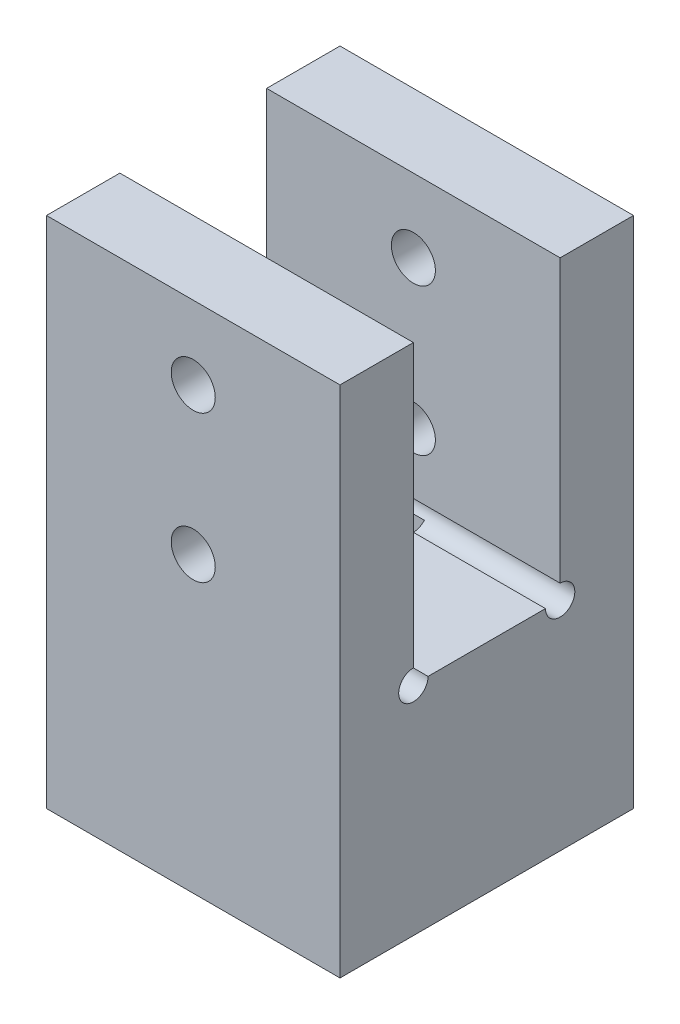
ISO-10303-21;
HEADER;
FILE_DESCRIPTION(('STEP AP214'),'2;1');
FILE_NAME('part.step','',(''),(''),'','','');
FILE_SCHEMA(('AUTOMOTIVE_DESIGN { 1 0 10303 214 1 1 1 1 }'));
ENDSEC;
DATA;
#1=APPLICATION_CONTEXT('core data for automotive mechanical design processes');
#2=APPLICATION_PROTOCOL_DEFINITION('international standard','automotive_design',2000,#1);
#3=PRODUCT_CONTEXT('',#1,'mechanical');
#4=PRODUCT('Part','Part','',(#3));
#5=PRODUCT_RELATED_PRODUCT_CATEGORY('part','',(#4));
#6=PRODUCT_DEFINITION_FORMATION('','',#4);
#7=PRODUCT_DEFINITION_CONTEXT('part definition',#1,'design');
#8=PRODUCT_DEFINITION('design','',#6,#7);
#9=PRODUCT_DEFINITION_SHAPE('','',#8);
#10=(LENGTH_UNIT() NAMED_UNIT(*) SI_UNIT(.MILLI.,.METRE.));
#11=(NAMED_UNIT(*) PLANE_ANGLE_UNIT() SI_UNIT($,.RADIAN.));
#12=(NAMED_UNIT(*) SI_UNIT($,.STERADIAN.) SOLID_ANGLE_UNIT());
#13=UNCERTAINTY_MEASURE_WITH_UNIT(LENGTH_MEASURE(1.E-05),#10,'distance_accuracy_value','');
#14=(GEOMETRIC_REPRESENTATION_CONTEXT(3) GLOBAL_UNCERTAINTY_ASSIGNED_CONTEXT((#13)) GLOBAL_UNIT_ASSIGNED_CONTEXT((#10,
#11,#12)) REPRESENTATION_CONTEXT('',''));
#15=CARTESIAN_POINT('',(0.,0.,0.));
#16=DIRECTION('',(0.,0.,1.));
#17=DIRECTION('',(1.,0.,0.));
#18=AXIS2_PLACEMENT_3D('',#15,#16,#17);
#19=CARTESIAN_POINT('',(-10.,-17.5,5.));
#20=DIRECTION('',(1.,0.,0.));
#21=DIRECTION('',(0.,0.,-1.));
#22=AXIS2_PLACEMENT_3D('',#19,#20,#21);
#23=PLANE('',#22);
#24=DIRECTION('',(0.,1.,0.));
#25=VECTOR('',#24,1.);
#26=CARTESIAN_POINT('',(-10.,-17.5,4.25));
#27=LINE('',#26,#25);
#28=CARTESIAN_POINT('',(-10.,-17.5,4.25));
#29=VERTEX_POINT('',#28);
#30=CARTESIAN_POINT('',(-10.,-3.36143782776615,4.25));
#31=VERTEX_POINT('',#30);
#32=EDGE_CURVE('E163',#29,#31,#27,.T.);
#33=ORIENTED_EDGE('',*,*,#32,.T.);
#34=CARTESIAN_POINT('',(-10.,-2.7,5.));
#35=DIRECTION('',(1.,0.,0.));
#36=DIRECTION('',(0.,0.,1.));
#37=AXIS2_PLACEMENT_3D('',#34,#35,#36);
#38=CIRCLE('',#37,1.);
#39=CARTESIAN_POINT('',(-10.,-1.7,5.));
#40=VERTEX_POINT('',#39);
#41=EDGE_CURVE('E213',#31,#40,#38,.T.);
#42=ORIENTED_EDGE('',*,*,#41,.T.);
#43=DIRECTION('',(0.,-1.,0.));
#44=VECTOR('',#43,1.);
#45=CARTESIAN_POINT('',(-10.,-17.5,5.));
#46=LINE('',#45,#44);
#47=CARTESIAN_POINT('',(-10.,17.5,5.));
#48=VERTEX_POINT('',#47);
#49=EDGE_CURVE('E285',#48,#40,#46,.T.);
#50=ORIENTED_EDGE('',*,*,#49,.F.);
#51=DIRECTION('',(0.,0.,-1.));
#52=VECTOR('',#51,1.);
#53=CARTESIAN_POINT('',(-10.,17.5,5.));
#54=LINE('',#53,#52);
#55=CARTESIAN_POINT('',(-10.,17.5,0.));
#56=VERTEX_POINT('',#55);
#57=EDGE_CURVE('E308',#48,#56,#54,.T.);
#58=ORIENTED_EDGE('',*,*,#57,.T.);
#59=DIRECTION('',(0.,-1.,0.));
#60=VECTOR('',#59,1.);
#61=CARTESIAN_POINT('',(-10.,-17.5,0.));
#62=LINE('',#61,#60);
#63=CARTESIAN_POINT('',(-10.,-17.5,0.));
#64=VERTEX_POINT('',#63);
#65=EDGE_CURVE('E296',#56,#64,#62,.T.);
#66=ORIENTED_EDGE('',*,*,#65,.T.);
#67=DIRECTION('',(0.,0.,-1.));
#68=VECTOR('',#67,1.);
#69=CARTESIAN_POINT('',(-10.,-17.5,5.));
#70=LINE('',#69,#68);
#71=EDGE_CURVE('E305',#29,#64,#70,.T.);
#72=ORIENTED_EDGE('',*,*,#71,.F.);
#73=EDGE_LOOP('',(#33,#42,#50,#58,#66,#72));
#74=FACE_BOUND('',#73,.T.);
#75=ADVANCED_FACE('F38',(#74),#23,.F.);
#76=CARTESIAN_POINT('',(-10.,-17.5,20.));
#77=DIRECTION('',(1.,0.,0.));
#78=DIRECTION('',(0.,0.,-1.));
#79=AXIS2_PLACEMENT_3D('',#76,#77,#78);
#80=PLANE('',#79);
#81=DIRECTION('',(0.,-1.,0.));
#82=VECTOR('',#81,1.);
#83=CARTESIAN_POINT('',(-10.,-17.5,15.75));
#84=LINE('',#83,#82);
#85=CARTESIAN_POINT('',(-10.,-3.36143782776615,15.75));
#86=VERTEX_POINT('',#85);
#87=CARTESIAN_POINT('',(-10.,-17.5,15.75));
#88=VERTEX_POINT('',#87);
#89=EDGE_CURVE('E53',#86,#88,#84,.T.);
#90=ORIENTED_EDGE('',*,*,#89,.T.);
#91=DIRECTION('',(0.,0.,-1.));
#92=VECTOR('',#91,1.);
#93=CARTESIAN_POINT('',(-10.,-17.5,20.));
#94=LINE('',#93,#92);
#95=CARTESIAN_POINT('',(-10.,-17.5,20.));
#96=VERTEX_POINT('',#95);
#97=EDGE_CURVE('E253',#96,#88,#94,.T.);
#98=ORIENTED_EDGE('',*,*,#97,.F.);
#99=DIRECTION('',(0.,-1.,0.));
#100=VECTOR('',#99,1.);
#101=CARTESIAN_POINT('',(-10.,-17.5,20.));
#102=LINE('',#101,#100);
#103=CARTESIAN_POINT('',(-10.,17.5,20.));
#104=VERTEX_POINT('',#103);
#105=EDGE_CURVE('E246',#104,#96,#102,.T.);
#106=ORIENTED_EDGE('',*,*,#105,.F.);
#107=DIRECTION('',(0.,0.,-1.));
#108=VECTOR('',#107,1.);
#109=CARTESIAN_POINT('',(-10.,17.5,20.));
#110=LINE('',#109,#108);
#111=CARTESIAN_POINT('',(-10.,17.5,15.));
#112=VERTEX_POINT('',#111);
#113=EDGE_CURVE('E264',#104,#112,#110,.T.);
#114=ORIENTED_EDGE('',*,*,#113,.T.);
#115=DIRECTION('',(0.,-1.,0.));
#116=VECTOR('',#115,1.);
#117=CARTESIAN_POINT('',(-10.,-17.5,15.));
#118=LINE('',#117,#116);
#119=CARTESIAN_POINT('',(-10.,-1.7,15.));
#120=VERTEX_POINT('',#119);
#121=EDGE_CURVE('E243',#112,#120,#118,.T.);
#122=ORIENTED_EDGE('',*,*,#121,.T.);
#123=CARTESIAN_POINT('',(-10.,-2.7,15.));
#124=DIRECTION('',(1.,0.,0.));
#125=DIRECTION('',(0.,0.,-1.));
#126=AXIS2_PLACEMENT_3D('',#123,#124,#125);
#127=CIRCLE('',#126,1.);
#128=EDGE_CURVE('E205',#120,#86,#127,.T.);
#129=ORIENTED_EDGE('',*,*,#128,.T.);
#130=EDGE_LOOP('',(#90,#98,#106,#114,#122,#129));
#131=FACE_BOUND('',#130,.T.);
#132=ADVANCED_FACE('F350',(#131),#80,.F.);
#133=CARTESIAN_POINT('',(0.,0.,5.));
#134=DIRECTION('',(0.,0.,-1.));
#135=DIRECTION('',(-1.,0.,0.));
#136=AXIS2_PLACEMENT_3D('',#133,#134,#135);
#137=PLANE('',#136);
#138=CARTESIAN_POINT('',(0.,12.5,5.));
#139=DIRECTION('',(0.,0.,-1.));
#140=DIRECTION('',(-1.,0.,0.));
#141=AXIS2_PLACEMENT_3D('',#138,#139,#140);
#142=CIRCLE('',#141,1.5);
#143=CARTESIAN_POINT('',(-1.5,12.5,5.));
#144=VERTEX_POINT('',#143);
#145=EDGE_CURVE('E200',#144,#144,#142,.T.);
#146=ORIENTED_EDGE('',*,*,#145,.T.);
#147=EDGE_LOOP('',(#146));
#148=FACE_BOUND('',#147,.T.);
#149=CARTESIAN_POINT('',(0.,2.50000000000001,5.));
#150=DIRECTION('',(0.,0.,-1.));
#151=DIRECTION('',(-1.,0.,0.));
#152=AXIS2_PLACEMENT_3D('',#149,#150,#151);
#153=CIRCLE('',#152,1.5);
#154=CARTESIAN_POINT('',(-1.5,2.50000000000001,5.));
#155=VERTEX_POINT('',#154);
#156=EDGE_CURVE('E192',#155,#155,#153,.T.);
#157=ORIENTED_EDGE('',*,*,#156,.T.);
#158=EDGE_LOOP('',(#157));
#159=FACE_BOUND('',#158,.T.);
#160=ORIENTED_EDGE('',*,*,#49,.T.);
#161=DIRECTION('',(1.,0.,0.));
#162=VECTOR('',#161,1.);
#163=CARTESIAN_POINT('',(-10.,-1.7,5.));
#164=LINE('',#163,#162);
#165=CARTESIAN_POINT('',(10.,-1.7,5.));
#166=VERTEX_POINT('',#165);
#167=EDGE_CURVE('E233',#40,#166,#164,.T.);
#168=ORIENTED_EDGE('',*,*,#167,.T.);
#169=DIRECTION('',(0.,1.,0.));
#170=VECTOR('',#169,1.);
#171=CARTESIAN_POINT('',(10.,-17.5,5.));
#172=LINE('',#171,#170);
#173=CARTESIAN_POINT('',(10.,17.5,5.));
#174=VERTEX_POINT('',#173);
#175=EDGE_CURVE('E278',#166,#174,#172,.T.);
#176=ORIENTED_EDGE('',*,*,#175,.T.);
#177=DIRECTION('',(-1.,0.,0.));
#178=VECTOR('',#177,1.);
#179=CARTESIAN_POINT('',(-10.,17.5,5.));
#180=LINE('',#179,#178);
#181=EDGE_CURVE('E281',#174,#48,#180,.T.);
#182=ORIENTED_EDGE('',*,*,#181,.T.);
#183=EDGE_LOOP('',(#160,#168,#176,#182));
#184=FACE_BOUND('',#183,.T.);
#185=ADVANCED_FACE('F329',(#148,#159,#184),#137,.F.);
#186=CARTESIAN_POINT('',(10.,-17.5,5.));
#187=DIRECTION('',(-1.,0.,0.));
#188=DIRECTION('',(0.,0.,1.));
#189=AXIS2_PLACEMENT_3D('',#186,#187,#188);
#190=PLANE('',#189);
#191=DIRECTION('',(0.,0.,-1.));
#192=VECTOR('',#191,1.);
#193=CARTESIAN_POINT('',(10.,-2.7,15.));
#194=LINE('',#193,#192);
#195=CARTESIAN_POINT('',(10.,-2.7,14.));
#196=VERTEX_POINT('',#195);
#197=CARTESIAN_POINT('',(10.,-2.7,6.));
#198=VERTEX_POINT('',#197);
#199=EDGE_CURVE('E152',#196,#198,#194,.T.);
#200=ORIENTED_EDGE('',*,*,#199,.F.);
#201=CARTESIAN_POINT('',(10.,-2.7,15.));
#202=DIRECTION('',(1.,0.,0.));
#203=DIRECTION('',(0.,0.,-1.));
#204=AXIS2_PLACEMENT_3D('',#201,#202,#203);
#205=CIRCLE('',#204,1.);
#206=CARTESIAN_POINT('',(10.,-1.7,15.));
#207=VERTEX_POINT('',#206);
#208=EDGE_CURVE('E210',#207,#196,#205,.T.);
#209=ORIENTED_EDGE('',*,*,#208,.F.);
#210=DIRECTION('',(0.,1.,0.));
#211=VECTOR('',#210,1.);
#212=CARTESIAN_POINT('',(10.,-17.5,15.));
#213=LINE('',#212,#211);
#214=CARTESIAN_POINT('',(10.,17.5,15.));
#215=VERTEX_POINT('',#214);
#216=EDGE_CURVE('E237',#207,#215,#213,.T.);
#217=ORIENTED_EDGE('',*,*,#216,.T.);
#218=DIRECTION('',(0.,0.,-1.));
#219=VECTOR('',#218,1.);
#220=CARTESIAN_POINT('',(10.,17.5,20.));
#221=LINE('',#220,#219);
#222=CARTESIAN_POINT('',(10.,17.5,20.));
#223=VERTEX_POINT('',#222);
#224=EDGE_CURVE('E268',#223,#215,#221,.T.);
#225=ORIENTED_EDGE('',*,*,#224,.F.);
#226=DIRECTION('',(0.,1.,0.));
#227=VECTOR('',#226,1.);
#228=CARTESIAN_POINT('',(10.,-17.5,20.));
#229=LINE('',#228,#227);
#230=CARTESIAN_POINT('',(10.,-17.5,20.));
#231=VERTEX_POINT('',#230);
#232=EDGE_CURVE('E238',#231,#223,#229,.T.);
#233=ORIENTED_EDGE('',*,*,#232,.F.);
#234=DIRECTION('',(0.,0.,-1.));
#235=VECTOR('',#234,1.);
#236=CARTESIAN_POINT('',(10.,-17.5,5.));
#237=LINE('',#236,#235);
#238=CARTESIAN_POINT('',(10.,-17.5,0.));
#239=VERTEX_POINT('',#238);
#240=EDGE_CURVE('E289',#231,#239,#237,.T.);
#241=ORIENTED_EDGE('',*,*,#240,.T.);
#242=DIRECTION('',(0.,1.,0.));
#243=VECTOR('',#242,1.);
#244=CARTESIAN_POINT('',(10.,-17.5,0.));
#245=LINE('',#244,#243);
#246=CARTESIAN_POINT('',(10.,17.5,0.));
#247=VERTEX_POINT('',#246);
#248=EDGE_CURVE('E277',#239,#247,#245,.T.);
#249=ORIENTED_EDGE('',*,*,#248,.T.);
#250=DIRECTION('',(0.,0.,-1.));
#251=VECTOR('',#250,1.);
#252=CARTESIAN_POINT('',(10.,17.5,5.));
#253=LINE('',#252,#251);
#254=EDGE_CURVE('E312',#174,#247,#253,.T.);
#255=ORIENTED_EDGE('',*,*,#254,.F.);
#256=ORIENTED_EDGE('',*,*,#175,.F.);
#257=CARTESIAN_POINT('',(10.,-2.7,5.));
#258=DIRECTION('',(1.,0.,0.));
#259=DIRECTION('',(0.,0.,1.));
#260=AXIS2_PLACEMENT_3D('',#257,#258,#259);
#261=CIRCLE('',#260,1.);
#262=EDGE_CURVE('E204',#198,#166,#261,.T.);
#263=ORIENTED_EDGE('',*,*,#262,.F.);
#264=EDGE_LOOP('',(#200,#209,#217,#225,#233,#241,#249,#255,#256,#263));
#265=FACE_BOUND('',#264,.T.);
#266=ADVANCED_FACE('F40',(#265),#190,.F.);
#267=CARTESIAN_POINT('',(-10.,17.5,5.));
#268=DIRECTION('',(0.,-1.,0.));
#269=DIRECTION('',(0.,0.,-1.));
#270=AXIS2_PLACEMENT_3D('',#267,#268,#269);
#271=PLANE('',#270);
#272=DIRECTION('',(-1.,0.,0.));
#273=VECTOR('',#272,1.);
#274=CARTESIAN_POINT('',(-10.,17.5,0.));
#275=LINE('',#274,#273);
#276=EDGE_CURVE('E293',#247,#56,#275,.T.);
#277=ORIENTED_EDGE('',*,*,#276,.T.);
#278=ORIENTED_EDGE('',*,*,#57,.F.);
#279=ORIENTED_EDGE('',*,*,#181,.F.);
#280=ORIENTED_EDGE('',*,*,#254,.T.);
#281=EDGE_LOOP('',(#277,#278,#279,#280));
#282=FACE_BOUND('',#281,.T.);
#283=ADVANCED_FACE('F380',(#282),#271,.F.);
#284=CARTESIAN_POINT('',(-10.,-17.5,5.));
#285=DIRECTION('',(0.,1.,0.));
#286=DIRECTION('',(0.,0.,1.));
#287=AXIS2_PLACEMENT_3D('',#284,#285,#286);
#288=PLANE('',#287);
#289=DIRECTION('',(1.,0.,0.));
#290=VECTOR('',#289,1.);
#291=CARTESIAN_POINT('',(-28.7427319246688,-17.5,15.75));
#292=LINE('',#291,#290);
#293=CARTESIAN_POINT('',(0.,-17.5,15.75));
#294=VERTEX_POINT('',#293);
#295=EDGE_CURVE('E147',#88,#294,#292,.T.);
#296=ORIENTED_EDGE('',*,*,#295,.T.);
#297=DIRECTION('',(0.,0.,-1.));
#298=VECTOR('',#297,1.);
#299=CARTESIAN_POINT('',(0.,-17.5,15.));
#300=LINE('',#299,#298);
#301=CARTESIAN_POINT('',(0.,-17.5,4.25));
#302=VERTEX_POINT('',#301);
#303=EDGE_CURVE('E141',#294,#302,#300,.T.);
#304=ORIENTED_EDGE('',*,*,#303,.T.);
#305=DIRECTION('',(1.,0.,0.));
#306=VECTOR('',#305,1.);
#307=CARTESIAN_POINT('',(-28.7427319246688,-17.5,4.25));
#308=LINE('',#307,#306);
#309=EDGE_CURVE('E144',#29,#302,#308,.T.);
#310=ORIENTED_EDGE('',*,*,#309,.F.);
#311=ORIENTED_EDGE('',*,*,#71,.T.);
#312=DIRECTION('',(1.,0.,0.));
#313=VECTOR('',#312,1.);
#314=CARTESIAN_POINT('',(-10.,-17.5,0.));
#315=LINE('',#314,#313);
#316=EDGE_CURVE('E282',#64,#239,#315,.T.);
#317=ORIENTED_EDGE('',*,*,#316,.T.);
#318=ORIENTED_EDGE('',*,*,#240,.F.);
#319=DIRECTION('',(1.,0.,0.));
#320=VECTOR('',#319,1.);
#321=CARTESIAN_POINT('',(10.,-17.5,20.));
#322=LINE('',#321,#320);
#323=EDGE_CURVE('E249',#96,#231,#322,.T.);
#324=ORIENTED_EDGE('',*,*,#323,.F.);
#325=ORIENTED_EDGE('',*,*,#97,.T.);
#326=EDGE_LOOP('',(#296,#304,#310,#311,#317,#318,#324,#325));
#327=FACE_BOUND('',#326,.T.);
#328=ADVANCED_FACE('F142',(#327),#288,.F.);
#329=CARTESIAN_POINT('',(0.,0.,0.));
#330=DIRECTION('',(0.,0.,-1.));
#331=DIRECTION('',(-1.,0.,0.));
#332=AXIS2_PLACEMENT_3D('',#329,#330,#331);
#333=PLANE('',#332);
#334=CARTESIAN_POINT('',(0.,12.5,0.));
#335=DIRECTION('',(0.,0.,1.));
#336=DIRECTION('',(1.,0.,0.));
#337=AXIS2_PLACEMENT_3D('',#334,#335,#336);
#338=CIRCLE('',#337,1.5);
#339=CARTESIAN_POINT('',(1.5,12.5,0.));
#340=VERTEX_POINT('',#339);
#341=EDGE_CURVE('E172',#340,#340,#338,.T.);
#342=ORIENTED_EDGE('',*,*,#341,.T.);
#343=EDGE_LOOP('',(#342));
#344=FACE_BOUND('',#343,.T.);
#345=CARTESIAN_POINT('',(0.,2.50000000000001,0.));
#346=DIRECTION('',(0.,0.,1.));
#347=DIRECTION('',(1.,0.,0.));
#348=AXIS2_PLACEMENT_3D('',#345,#346,#347);
#349=CIRCLE('',#348,1.5);
#350=CARTESIAN_POINT('',(1.5,2.50000000000001,0.));
#351=VERTEX_POINT('',#350);
#352=EDGE_CURVE('E181',#351,#351,#349,.T.);
#353=ORIENTED_EDGE('',*,*,#352,.T.);
#354=EDGE_LOOP('',(#353));
#355=FACE_BOUND('',#354,.T.);
#356=ORIENTED_EDGE('',*,*,#248,.F.);
#357=ORIENTED_EDGE('',*,*,#316,.F.);
#358=ORIENTED_EDGE('',*,*,#65,.F.);
#359=ORIENTED_EDGE('',*,*,#276,.F.);
#360=EDGE_LOOP('',(#356,#357,#358,#359));
#361=FACE_BOUND('',#360,.T.);
#362=ADVANCED_FACE('F337',(#344,#355,#361),#333,.T.);
#363=CARTESIAN_POINT('',(10.,-2.7,15.));
#364=DIRECTION('',(0.,-1.,0.));
#365=DIRECTION('',(1.,0.,0.));
#366=AXIS2_PLACEMENT_3D('',#363,#364,#365);
#367=PLANE('',#366);
#368=DIRECTION('',(0.,0.,-1.));
#369=VECTOR('',#368,1.);
#370=CARTESIAN_POINT('',(0.,-2.7,15.));
#371=LINE('',#370,#369);
#372=CARTESIAN_POINT('',(0.,-2.7,14.));
#373=VERTEX_POINT('',#372);
#374=CARTESIAN_POINT('',(0.,-2.7,6.));
#375=VERTEX_POINT('',#374);
#376=EDGE_CURVE('E151',#373,#375,#371,.T.);
#377=ORIENTED_EDGE('',*,*,#376,.F.);
#378=DIRECTION('',(1.,0.,0.));
#379=VECTOR('',#378,1.);
#380=CARTESIAN_POINT('',(-10.,-2.7,14.));
#381=LINE('',#380,#379);
#382=EDGE_CURVE('E225',#373,#196,#381,.T.);
#383=ORIENTED_EDGE('',*,*,#382,.T.);
#384=ORIENTED_EDGE('',*,*,#199,.T.);
#385=DIRECTION('',(1.,0.,0.));
#386=VECTOR('',#385,1.);
#387=CARTESIAN_POINT('',(-10.,-2.7,6.));
#388=LINE('',#387,#386);
#389=EDGE_CURVE('E229',#198,#375,#388,.F.);
#390=ORIENTED_EDGE('',*,*,#389,.T.);
#391=EDGE_LOOP('',(#377,#383,#384,#390));
#392=FACE_BOUND('',#391,.T.);
#393=ADVANCED_FACE('F361',(#392),#367,.F.);
#394=CARTESIAN_POINT('',(0.,-2.7,15.));
#395=DIRECTION('',(1.,0.,0.));
#396=DIRECTION('',(0.,1.,0.));
#397=AXIS2_PLACEMENT_3D('',#394,#395,#396);
#398=PLANE('',#397);
#399=ORIENTED_EDGE('',*,*,#303,.F.);
#400=DIRECTION('',(0.,1.,0.));
#401=VECTOR('',#400,1.);
#402=CARTESIAN_POINT('',(0.,-17.5,15.75));
#403=LINE('',#402,#401);
#404=CARTESIAN_POINT('',(0.,-3.36143782776615,15.75));
#405=VERTEX_POINT('',#404);
#406=EDGE_CURVE('E159',#294,#405,#403,.T.);
#407=ORIENTED_EDGE('',*,*,#406,.T.);
#408=CARTESIAN_POINT('',(0.,-2.7,15.));
#409=DIRECTION('',(1.,0.,0.));
#410=DIRECTION('',(0.,1.,0.));
#411=AXIS2_PLACEMENT_3D('',#408,#409,#410);
#412=CIRCLE('',#411,1.);
#413=EDGE_CURVE('E221',#405,#373,#412,.T.);
#414=ORIENTED_EDGE('',*,*,#413,.T.);
#415=ORIENTED_EDGE('',*,*,#376,.T.);
#416=CARTESIAN_POINT('',(0.,-2.7,5.));
#417=DIRECTION('',(1.,0.,0.));
#418=DIRECTION('',(0.,1.,0.));
#419=AXIS2_PLACEMENT_3D('',#416,#417,#418);
#420=CIRCLE('',#419,1.);
#421=CARTESIAN_POINT('',(0.,-3.36143782776615,4.25));
#422=VERTEX_POINT('',#421);
#423=EDGE_CURVE('E61',#375,#422,#420,.T.);
#424=ORIENTED_EDGE('',*,*,#423,.T.);
#425=DIRECTION('',(0.,-1.,0.));
#426=VECTOR('',#425,1.);
#427=CARTESIAN_POINT('',(0.,-17.5,4.25));
#428=LINE('',#427,#426);
#429=EDGE_CURVE('E154',#422,#302,#428,.T.);
#430=ORIENTED_EDGE('',*,*,#429,.T.);
#431=EDGE_LOOP('',(#399,#407,#414,#415,#424,#430));
#432=FACE_BOUND('',#431,.T.);
#433=ADVANCED_FACE('F155',(#432),#398,.F.);
#434=CARTESIAN_POINT('',(0.,0.,15.));
#435=DIRECTION('',(0.,0.,1.));
#436=DIRECTION('',(1.,0.,0.));
#437=AXIS2_PLACEMENT_3D('',#434,#435,#436);
#438=PLANE('',#437);
#439=CARTESIAN_POINT('',(0.,12.5,15.));
#440=DIRECTION('',(0.,0.,1.));
#441=DIRECTION('',(1.,0.,0.));
#442=AXIS2_PLACEMENT_3D('',#439,#440,#441);
#443=CIRCLE('',#442,1.5);
#444=CARTESIAN_POINT('',(1.5,12.5,15.));
#445=VERTEX_POINT('',#444);
#446=EDGE_CURVE('E196',#445,#445,#443,.T.);
#447=ORIENTED_EDGE('',*,*,#446,.T.);
#448=EDGE_LOOP('',(#447));
#449=FACE_BOUND('',#448,.T.);
#450=CARTESIAN_POINT('',(0.,2.50000000000001,15.));
#451=DIRECTION('',(0.,0.,1.));
#452=DIRECTION('',(1.,0.,0.));
#453=AXIS2_PLACEMENT_3D('',#450,#451,#452);
#454=CIRCLE('',#453,1.5);
#455=CARTESIAN_POINT('',(1.5,2.50000000000001,15.));
#456=VERTEX_POINT('',#455);
#457=EDGE_CURVE('E176',#456,#456,#454,.T.);
#458=ORIENTED_EDGE('',*,*,#457,.T.);
#459=EDGE_LOOP('',(#458));
#460=FACE_BOUND('',#459,.T.);
#461=ORIENTED_EDGE('',*,*,#216,.F.);
#462=DIRECTION('',(1.,0.,0.));
#463=VECTOR('',#462,1.);
#464=CARTESIAN_POINT('',(-10.,-1.7,15.));
#465=LINE('',#464,#463);
#466=EDGE_CURVE('E209',#207,#120,#465,.F.);
#467=ORIENTED_EDGE('',*,*,#466,.T.);
#468=ORIENTED_EDGE('',*,*,#121,.F.);
#469=DIRECTION('',(-1.,0.,0.));
#470=VECTOR('',#469,1.);
#471=CARTESIAN_POINT('',(10.,17.5,15.));
#472=LINE('',#471,#470);
#473=EDGE_CURVE('E256',#215,#112,#472,.T.);
#474=ORIENTED_EDGE('',*,*,#473,.F.);
#475=EDGE_LOOP('',(#461,#467,#468,#474));
#476=FACE_BOUND('',#475,.T.);
#477=ADVANCED_FACE('F357',(#449,#460,#476),#438,.F.);
#478=CARTESIAN_POINT('',(10.,17.5,20.));
#479=DIRECTION('',(0.,-1.,0.));
#480=DIRECTION('',(0.,0.,-1.));
#481=AXIS2_PLACEMENT_3D('',#478,#479,#480);
#482=PLANE('',#481);
#483=ORIENTED_EDGE('',*,*,#473,.T.);
#484=ORIENTED_EDGE('',*,*,#113,.F.);
#485=DIRECTION('',(-1.,0.,0.));
#486=VECTOR('',#485,1.);
#487=CARTESIAN_POINT('',(10.,17.5,20.));
#488=LINE('',#487,#486);
#489=EDGE_CURVE('E242',#223,#104,#488,.T.);
#490=ORIENTED_EDGE('',*,*,#489,.F.);
#491=ORIENTED_EDGE('',*,*,#224,.T.);
#492=EDGE_LOOP('',(#483,#484,#490,#491));
#493=FACE_BOUND('',#492,.T.);
#494=ADVANCED_FACE('F433',(#493),#482,.F.);
#495=CARTESIAN_POINT('',(0.,0.,20.));
#496=DIRECTION('',(0.,0.,1.));
#497=DIRECTION('',(1.,0.,0.));
#498=AXIS2_PLACEMENT_3D('',#495,#496,#497);
#499=PLANE('',#498);
#500=CARTESIAN_POINT('',(0.,12.5,20.));
#501=DIRECTION('',(0.,0.,1.));
#502=DIRECTION('',(1.,0.,0.));
#503=AXIS2_PLACEMENT_3D('',#500,#501,#502);
#504=CIRCLE('',#503,1.5);
#505=CARTESIAN_POINT('',(1.5,12.5,20.));
#506=VERTEX_POINT('',#505);
#507=EDGE_CURVE('E177',#506,#506,#504,.T.);
#508=ORIENTED_EDGE('',*,*,#507,.F.);
#509=EDGE_LOOP('',(#508));
#510=FACE_BOUND('',#509,.T.);
#511=CARTESIAN_POINT('',(0.,2.50000000000001,20.));
#512=DIRECTION('',(0.,0.,1.));
#513=DIRECTION('',(1.,0.,0.));
#514=AXIS2_PLACEMENT_3D('',#511,#512,#513);
#515=CIRCLE('',#514,1.5);
#516=CARTESIAN_POINT('',(1.5,2.50000000000001,20.));
#517=VERTEX_POINT('',#516);
#518=EDGE_CURVE('E185',#517,#517,#515,.T.);
#519=ORIENTED_EDGE('',*,*,#518,.F.);
#520=EDGE_LOOP('',(#519));
#521=FACE_BOUND('',#520,.T.);
#522=ORIENTED_EDGE('',*,*,#232,.T.);
#523=ORIENTED_EDGE('',*,*,#489,.T.);
#524=ORIENTED_EDGE('',*,*,#105,.T.);
#525=ORIENTED_EDGE('',*,*,#323,.T.);
#526=EDGE_LOOP('',(#522,#523,#524,#525));
#527=FACE_BOUND('',#526,.T.);
#528=ADVANCED_FACE('F345',(#510,#521,#527),#499,.T.);
#529=CARTESIAN_POINT('',(-10.,-2.7,15.));
#530=DIRECTION('',(1.,0.,0.));
#531=DIRECTION('',(0.,0.,-1.));
#532=AXIS2_PLACEMENT_3D('',#529,#530,#531);
#533=CYLINDRICAL_SURFACE('',#532,1.);
#534=ORIENTED_EDGE('',*,*,#413,.F.);
#535=DIRECTION('',(1.,0.,0.));
#536=VECTOR('',#535,1.);
#537=CARTESIAN_POINT('',(-10.,-3.36143782776615,15.75));
#538=LINE('',#537,#536);
#539=EDGE_CURVE('E11',#86,#405,#538,.T.);
#540=ORIENTED_EDGE('',*,*,#539,.F.);
#541=ORIENTED_EDGE('',*,*,#128,.F.);
#542=ORIENTED_EDGE('',*,*,#466,.F.);
#543=ORIENTED_EDGE('',*,*,#208,.T.);
#544=ORIENTED_EDGE('',*,*,#382,.F.);
#545=EDGE_LOOP('',(#534,#540,#541,#542,#543,#544));
#546=FACE_BOUND('',#545,.T.);
#547=ADVANCED_FACE('F353',(#546),#533,.F.);
#548=CARTESIAN_POINT('',(-10.,-2.7,5.));
#549=DIRECTION('',(1.,0.,0.));
#550=DIRECTION('',(0.,0.,-1.));
#551=AXIS2_PLACEMENT_3D('',#548,#549,#550);
#552=CYLINDRICAL_SURFACE('',#551,1.);
#553=DIRECTION('',(1.,0.,0.));
#554=VECTOR('',#553,1.);
#555=CARTESIAN_POINT('',(-10.,-3.36143782776615,4.25));
#556=LINE('',#555,#554);
#557=EDGE_CURVE('E47',#422,#31,#556,.F.);
#558=ORIENTED_EDGE('',*,*,#557,.F.);
#559=ORIENTED_EDGE('',*,*,#423,.F.);
#560=ORIENTED_EDGE('',*,*,#389,.F.);
#561=ORIENTED_EDGE('',*,*,#262,.T.);
#562=ORIENTED_EDGE('',*,*,#167,.F.);
#563=ORIENTED_EDGE('',*,*,#41,.F.);
#564=EDGE_LOOP('',(#558,#559,#560,#561,#562,#563));
#565=FACE_BOUND('',#564,.T.);
#566=ADVANCED_FACE('F325',(#565),#552,.F.);
#567=CARTESIAN_POINT('',(0.,2.50000000000001,0.));
#568=DIRECTION('',(0.,0.,1.));
#569=DIRECTION('',(1.,0.,0.));
#570=AXIS2_PLACEMENT_3D('',#567,#568,#569);
#571=CYLINDRICAL_SURFACE('',#570,1.5);
#572=ORIENTED_EDGE('',*,*,#518,.T.);
#573=EDGE_LOOP('',(#572));
#574=FACE_BOUND('',#573,.T.);
#575=ORIENTED_EDGE('',*,*,#457,.F.);
#576=EDGE_LOOP('',(#575));
#577=FACE_BOUND('',#576,.T.);
#578=ADVANCED_FACE('F411',(#574,#577),#571,.F.);
#579=CARTESIAN_POINT('',(0.,12.5,0.));
#580=DIRECTION('',(0.,0.,1.));
#581=DIRECTION('',(1.,0.,0.));
#582=AXIS2_PLACEMENT_3D('',#579,#580,#581);
#583=CYLINDRICAL_SURFACE('',#582,1.5);
#584=ORIENTED_EDGE('',*,*,#507,.T.);
#585=EDGE_LOOP('',(#584));
#586=FACE_BOUND('',#585,.T.);
#587=ORIENTED_EDGE('',*,*,#446,.F.);
#588=EDGE_LOOP('',(#587));
#589=FACE_BOUND('',#588,.T.);
#590=ADVANCED_FACE('F409',(#586,#589),#583,.F.);
#591=ORIENTED_EDGE('',*,*,#352,.F.);
#592=EDGE_LOOP('',(#591));
#593=FACE_BOUND('',#592,.T.);
#594=ORIENTED_EDGE('',*,*,#156,.F.);
#595=EDGE_LOOP('',(#594));
#596=FACE_BOUND('',#595,.T.);
#597=ADVANCED_FACE('F406',(#593,#596),#571,.F.);
#598=ORIENTED_EDGE('',*,*,#341,.F.);
#599=EDGE_LOOP('',(#598));
#600=FACE_BOUND('',#599,.T.);
#601=ORIENTED_EDGE('',*,*,#145,.F.);
#602=EDGE_LOOP('',(#601));
#603=FACE_BOUND('',#602,.T.);
#604=ADVANCED_FACE('F369',(#600,#603),#583,.F.);
#605=CARTESIAN_POINT('',(-28.7427319246688,-17.5,4.25));
#606=DIRECTION('',(0.,0.,1.));
#607=DIRECTION('',(1.,0.,0.));
#608=AXIS2_PLACEMENT_3D('',#605,#606,#607);
#609=PLANE('',#608);
#610=ORIENTED_EDGE('',*,*,#557,.T.);
#611=ORIENTED_EDGE('',*,*,#32,.F.);
#612=ORIENTED_EDGE('',*,*,#309,.T.);
#613=ORIENTED_EDGE('',*,*,#429,.F.);
#614=EDGE_LOOP('',(#610,#611,#612,#613));
#615=FACE_BOUND('',#614,.T.);
#616=ADVANCED_FACE('F161',(#615),#609,.T.);
#617=CARTESIAN_POINT('',(-28.7427319246688,-17.5,15.75));
#618=DIRECTION('',(0.,0.,-1.));
#619=DIRECTION('',(-1.,0.,0.));
#620=AXIS2_PLACEMENT_3D('',#617,#618,#619);
#621=PLANE('',#620);
#622=ORIENTED_EDGE('',*,*,#539,.T.);
#623=ORIENTED_EDGE('',*,*,#406,.F.);
#624=ORIENTED_EDGE('',*,*,#295,.F.);
#625=ORIENTED_EDGE('',*,*,#89,.F.);
#626=EDGE_LOOP('',(#622,#623,#624,#625));
#627=FACE_BOUND('',#626,.T.);
#628=ADVANCED_FACE('F362',(#627),#621,.T.);
#629=CLOSED_SHELL('',(#75,#132,#185,#266,#283,#328,#362,#393,#433,#477,#494,#528,#547,#566,#578,
#590,#597,#604,#616,#628));
#630=MANIFOLD_SOLID_BREP('B2',#629);
#631=ADVANCED_BREP_SHAPE_REPRESENTATION('',(#18,#630),#14);
#632=SHAPE_DEFINITION_REPRESENTATION(#9,#631);
ENDSEC;
END-ISO-10303-21;
